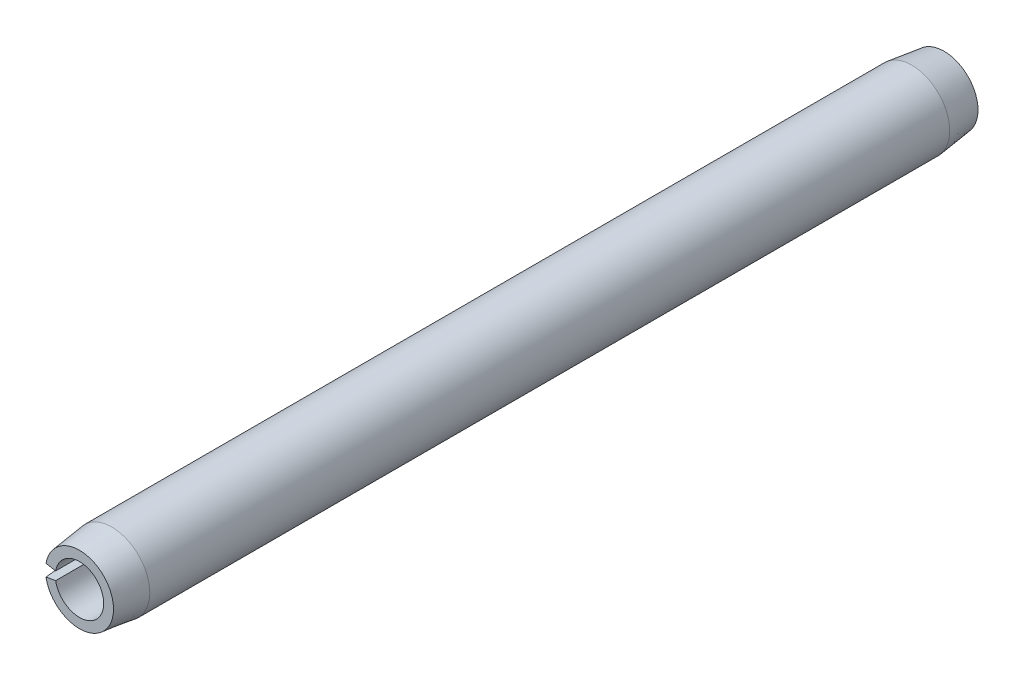
ISO-10303-21;
HEADER;
FILE_DESCRIPTION(('STEP AP214'),'2;1');
FILE_NAME('part.step','',(''),(''),'','','');
FILE_SCHEMA(('AUTOMOTIVE_DESIGN { 1 0 10303 214 1 1 1 1 }'));
ENDSEC;
DATA;
#1=APPLICATION_CONTEXT('core data for automotive mechanical design processes');
#2=APPLICATION_PROTOCOL_DEFINITION('international standard','automotive_design',2000,#1);
#3=PRODUCT_CONTEXT('',#1,'mechanical');
#4=PRODUCT('Part','Part','',(#3));
#5=PRODUCT_RELATED_PRODUCT_CATEGORY('part','',(#4));
#6=PRODUCT_DEFINITION_FORMATION('','',#4);
#7=PRODUCT_DEFINITION_CONTEXT('part definition',#1,'design');
#8=PRODUCT_DEFINITION('design','',#6,#7);
#9=PRODUCT_DEFINITION_SHAPE('','',#8);
#10=(LENGTH_UNIT() NAMED_UNIT(*) SI_UNIT(.MILLI.,.METRE.));
#11=(NAMED_UNIT(*) PLANE_ANGLE_UNIT() SI_UNIT($,.RADIAN.));
#12=(NAMED_UNIT(*) SI_UNIT($,.STERADIAN.) SOLID_ANGLE_UNIT());
#13=UNCERTAINTY_MEASURE_WITH_UNIT(LENGTH_MEASURE(1.E-05),#10,'distance_accuracy_value','');
#14=(GEOMETRIC_REPRESENTATION_CONTEXT(3) GLOBAL_UNCERTAINTY_ASSIGNED_CONTEXT((#13)) GLOBAL_UNIT_ASSIGNED_CONTEXT((#10,
#11,#12)) REPRESENTATION_CONTEXT('',''));
#15=CARTESIAN_POINT('',(0.,0.,0.));
#16=DIRECTION('',(0.,0.,1.));
#17=DIRECTION('',(1.,0.,0.));
#18=AXIS2_PLACEMENT_3D('',#15,#16,#17);
#19=CARTESIAN_POINT('',(0.,0.,9.52499999999999));
#20=DIRECTION('',(0.,0.,-1.));
#21=DIRECTION('',(-1.,0.,0.));
#22=AXIS2_PLACEMENT_3D('',#19,#20,#21);
#23=CYLINDRICAL_SURFACE('',#22,0.5334);
#24=CARTESIAN_POINT('',(0.,0.,-9.52500000000001));
#25=DIRECTION('',(0.,0.,-1.));
#26=DIRECTION('',(1.,0.,0.));
#27=AXIS2_PLACEMENT_3D('',#24,#25,#26);
#28=CIRCLE('',#27,0.5334);
#29=CARTESIAN_POINT('',(-0.525296455456681,0.0926239379675509,-9.52500000000001));
#30=VERTEX_POINT('',#29);
#31=CARTESIAN_POINT('',(-0.525296455456709,-0.0926239379675231,-9.52500000000001));
#32=VERTEX_POINT('',#31);
#33=EDGE_CURVE('E120',#30,#32,#28,.T.);
#34=ORIENTED_EDGE('',*,*,#33,.T.);
#35=DIRECTION('',(0.,0.,-1.));
#36=VECTOR('',#35,1.);
#37=CARTESIAN_POINT('',(-0.525296455456709,-0.0926239379675231,9.52499999999999));
#38=LINE('',#37,#36);
#39=CARTESIAN_POINT('',(-0.525296455456709,-0.0926239379675231,9.52499999999999));
#40=VERTEX_POINT('',#39);
#41=EDGE_CURVE('E11',#40,#32,#38,.T.);
#42=ORIENTED_EDGE('',*,*,#41,.F.);
#43=CARTESIAN_POINT('',(0.,0.,9.52499999999999));
#44=DIRECTION('',(0.,0.,-1.));
#45=DIRECTION('',(1.,0.,0.));
#46=AXIS2_PLACEMENT_3D('',#43,#44,#45);
#47=CIRCLE('',#46,0.5334);
#48=CARTESIAN_POINT('',(-0.525296455456681,0.0926239379675509,9.52499999999999));
#49=VERTEX_POINT('',#48);
#50=EDGE_CURVE('E116',#49,#40,#47,.T.);
#51=ORIENTED_EDGE('',*,*,#50,.F.);
#52=DIRECTION('',(0.,0.,-1.));
#53=VECTOR('',#52,1.);
#54=CARTESIAN_POINT('',(-0.525296455456681,0.0926239379675509,9.52499999999999));
#55=LINE('',#54,#53);
#56=EDGE_CURVE('E109',#49,#30,#55,.T.);
#57=ORIENTED_EDGE('',*,*,#56,.T.);
#58=EDGE_LOOP('',(#34,#42,#51,#57));
#59=FACE_BOUND('',#58,.T.);
#60=ADVANCED_FACE('F37',(#59),#23,.F.);
#61=CARTESIAN_POINT('',(-0.525296455456709,-0.0926239379675231,9.52499999999999));
#62=DIRECTION('',(0.173648177666927,-0.984807753012209,0.));
#63=DIRECTION('',(0.984807753012209,0.173648177666927,0.));
#64=AXIS2_PLACEMENT_3D('',#61,#62,#63);
#65=PLANE('',#64);
#66=DIRECTION('',(0.,0.,-1.));
#67=VECTOR('',#66,1.);
#68=CARTESIAN_POINT('',(-0.825465858574778,-0.145551902520413,9.52499999999999));
#69=LINE('',#68,#67);
#70=CARTESIAN_POINT('',(-0.825465858574778,-0.145551902520413,8.8138));
#71=VERTEX_POINT('',#70);
#72=CARTESIAN_POINT('',(-0.825465858574778,-0.145551902520413,-8.8138));
#73=VERTEX_POINT('',#72);
#74=EDGE_CURVE('E44',#71,#73,#69,.T.);
#75=ORIENTED_EDGE('',*,*,#74,.F.);
#76=DIRECTION('',(-0.122150368266264,-0.0215384056288171,-0.992277876713668));
#77=VECTOR('',#76,1.);
#78=CARTESIAN_POINT('',(0.,0.,15.5194));
#79=LINE('',#78,#77);
#80=CARTESIAN_POINT('',(-0.737916449332049,-0.130114579525831,9.52499999999999));
#81=VERTEX_POINT('',#80);
#82=EDGE_CURVE('E91',#71,#81,#79,.F.);
#83=ORIENTED_EDGE('',*,*,#82,.T.);
#84=DIRECTION('',(-0.984807753012209,-0.173648177666927,0.));
#85=VECTOR('',#84,1.);
#86=CARTESIAN_POINT('',(-0.525296455456709,-0.0926239379675231,9.52499999999999));
#87=LINE('',#86,#85);
#88=EDGE_CURVE('E124',#40,#81,#87,.T.);
#89=ORIENTED_EDGE('',*,*,#88,.F.);
#90=ORIENTED_EDGE('',*,*,#41,.T.);
#91=DIRECTION('',(-0.984807753012209,-0.173648177666927,0.));
#92=VECTOR('',#91,1.);
#93=CARTESIAN_POINT('',(-0.525296455456709,-0.0926239379675231,-9.52500000000001));
#94=LINE('',#93,#92);
#95=CARTESIAN_POINT('',(-0.737916449332049,-0.130114579525831,-9.52500000000001));
#96=VERTEX_POINT('',#95);
#97=EDGE_CURVE('E117',#32,#96,#94,.T.);
#98=ORIENTED_EDGE('',*,*,#97,.T.);
#99=DIRECTION('',(0.122150368266264,0.021538405628817,-0.992277876713668));
#100=VECTOR('',#99,1.);
#101=CARTESIAN_POINT('',(0.,0.,-15.5194));
#102=LINE('',#101,#100);
#103=EDGE_CURVE('E59',#96,#73,#102,.F.);
#104=ORIENTED_EDGE('',*,*,#103,.T.);
#105=EDGE_LOOP('',(#75,#83,#89,#90,#98,#104));
#106=FACE_BOUND('',#105,.T.);
#107=ADVANCED_FACE('F138',(#106),#65,.F.);
#108=CARTESIAN_POINT('',(0.,0.,9.52499999999999));
#109=DIRECTION('',(0.,0.,-1.));
#110=DIRECTION('',(-1.,0.,0.));
#111=AXIS2_PLACEMENT_3D('',#108,#109,#110);
#112=CYLINDRICAL_SURFACE('',#111,0.8382);
#113=DIRECTION('',(0.,0.,-1.));
#114=VECTOR('',#113,1.);
#115=CARTESIAN_POINT('',(-0.825465858574848,0.145551902520413,9.52499999999999));
#116=LINE('',#115,#114);
#117=CARTESIAN_POINT('',(-0.825465858574848,0.145551902520413,8.8138));
#118=VERTEX_POINT('',#117);
#119=CARTESIAN_POINT('',(-0.825465858574848,0.145551902520413,-8.8138));
#120=VERTEX_POINT('',#119);
#121=EDGE_CURVE('E101',#118,#120,#116,.T.);
#122=ORIENTED_EDGE('',*,*,#121,.F.);
#123=CARTESIAN_POINT('',(0.,0.,8.8138));
#124=DIRECTION('',(0.,0.,-1.));
#125=DIRECTION('',(-1.,0.,0.));
#126=AXIS2_PLACEMENT_3D('',#123,#124,#125);
#127=CIRCLE('',#126,0.838200000000001);
#128=EDGE_CURVE('E88',#118,#71,#127,.T.);
#129=ORIENTED_EDGE('',*,*,#128,.T.);
#130=ORIENTED_EDGE('',*,*,#74,.T.);
#131=CARTESIAN_POINT('',(0.,0.,-8.8138));
#132=DIRECTION('',(0.,0.,-1.));
#133=DIRECTION('',(-1.,0.,0.));
#134=AXIS2_PLACEMENT_3D('',#131,#132,#133);
#135=CIRCLE('',#134,0.838200000000001);
#136=EDGE_CURVE('E108',#120,#73,#135,.T.);
#137=ORIENTED_EDGE('',*,*,#136,.F.);
#138=EDGE_LOOP('',(#122,#129,#130,#137));
#139=FACE_BOUND('',#138,.T.);
#140=ADVANCED_FACE('F107',(#139),#112,.T.);
#141=CARTESIAN_POINT('',(-0.825465858574848,0.145551902520413,9.52499999999999));
#142=DIRECTION('',(0.173648177666927,0.984807753012209,0.));
#143=DIRECTION('',(-0.984807753012208,0.173648177666927,0.));
#144=AXIS2_PLACEMENT_3D('',#141,#142,#143);
#145=PLANE('',#144);
#146=DIRECTION('',(0.984807753012208,-0.173648177666927,0.));
#147=VECTOR('',#146,1.);
#148=CARTESIAN_POINT('',(-0.825465858574848,0.145551902520413,9.52499999999999));
#149=LINE('',#148,#147);
#150=CARTESIAN_POINT('',(-0.737916449332049,0.130114579525831,9.52499999999999));
#151=VERTEX_POINT('',#150);
#152=EDGE_CURVE('E104',#151,#49,#149,.T.);
#153=ORIENTED_EDGE('',*,*,#152,.F.);
#154=DIRECTION('',(0.122150368266264,-0.021538405628817,0.992277876713668));
#155=VECTOR('',#154,1.);
#156=CARTESIAN_POINT('',(0.,0.,15.5194));
#157=LINE('',#156,#155);
#158=EDGE_CURVE('E51',#151,#118,#157,.F.);
#159=ORIENTED_EDGE('',*,*,#158,.T.);
#160=ORIENTED_EDGE('',*,*,#121,.T.);
#161=DIRECTION('',(-0.122150368266264,0.021538405628817,0.992277876713668));
#162=VECTOR('',#161,1.);
#163=CARTESIAN_POINT('',(0.,0.,-15.5194));
#164=LINE('',#163,#162);
#165=CARTESIAN_POINT('',(-0.737916449332049,0.130114579525831,-9.52500000000001));
#166=VERTEX_POINT('',#165);
#167=EDGE_CURVE('E130',#120,#166,#164,.F.);
#168=ORIENTED_EDGE('',*,*,#167,.T.);
#169=DIRECTION('',(0.984807753012208,-0.173648177666927,0.));
#170=VECTOR('',#169,1.);
#171=CARTESIAN_POINT('',(-0.825465858574848,0.145551902520413,-9.52500000000001));
#172=LINE('',#171,#170);
#173=EDGE_CURVE('E114',#166,#30,#172,.T.);
#174=ORIENTED_EDGE('',*,*,#173,.T.);
#175=ORIENTED_EDGE('',*,*,#56,.F.);
#176=EDGE_LOOP('',(#153,#159,#160,#168,#174,#175));
#177=FACE_BOUND('',#176,.T.);
#178=ADVANCED_FACE('F99',(#177),#145,.F.);
#179=CARTESIAN_POINT('',(0.,0.,9.52499999999999));
#180=DIRECTION('',(0.,0.,1.));
#181=DIRECTION('',(1.,0.,0.));
#182=AXIS2_PLACEMENT_3D('',#179,#180,#181);
#183=PLANE('',#182);
#184=CARTESIAN_POINT('',(0.,0.,9.52499999999999));
#185=DIRECTION('',(0.,0.,-1.));
#186=DIRECTION('',(-1.,0.,0.));
#187=AXIS2_PLACEMENT_3D('',#184,#185,#186);
#188=CIRCLE('',#187,0.749300000000001);
#189=EDGE_CURVE('E95',#151,#81,#188,.T.);
#190=ORIENTED_EDGE('',*,*,#189,.F.);
#191=ORIENTED_EDGE('',*,*,#152,.T.);
#192=ORIENTED_EDGE('',*,*,#50,.T.);
#193=ORIENTED_EDGE('',*,*,#88,.T.);
#194=EDGE_LOOP('',(#190,#191,#192,#193));
#195=FACE_BOUND('',#194,.T.);
#196=ADVANCED_FACE('F139',(#195),#183,.T.);
#197=CARTESIAN_POINT('',(0.,0.,-9.52500000000001));
#198=DIRECTION('',(0.,0.,1.));
#199=DIRECTION('',(1.,0.,0.));
#200=AXIS2_PLACEMENT_3D('',#197,#198,#199);
#201=PLANE('',#200);
#202=ORIENTED_EDGE('',*,*,#173,.F.);
#203=CARTESIAN_POINT('',(0.,0.,-9.52500000000001));
#204=DIRECTION('',(0.,0.,-1.));
#205=DIRECTION('',(-1.,0.,0.));
#206=AXIS2_PLACEMENT_3D('',#203,#204,#205);
#207=CIRCLE('',#206,0.749300000000001);
#208=EDGE_CURVE('E132',#166,#96,#207,.T.);
#209=ORIENTED_EDGE('',*,*,#208,.T.);
#210=ORIENTED_EDGE('',*,*,#97,.F.);
#211=ORIENTED_EDGE('',*,*,#33,.F.);
#212=EDGE_LOOP('',(#202,#209,#210,#211));
#213=FACE_BOUND('',#212,.T.);
#214=ADVANCED_FACE('F146',(#213),#201,.F.);
#215=CARTESIAN_POINT('',(0.,0.,-8.8138));
#216=DIRECTION('',(0.,0.,1.));
#217=DIRECTION('',(1.,0.,0.));
#218=AXIS2_PLACEMENT_3D('',#215,#216,#217);
#219=CONICAL_SURFACE('',#218,0.838200000000001,0.124354994546761);
#220=ORIENTED_EDGE('',*,*,#208,.F.);
#221=ORIENTED_EDGE('',*,*,#167,.F.);
#222=ORIENTED_EDGE('',*,*,#136,.T.);
#223=ORIENTED_EDGE('',*,*,#103,.F.);
#224=EDGE_LOOP('',(#220,#221,#222,#223));
#225=FACE_BOUND('',#224,.T.);
#226=ADVANCED_FACE('F147',(#225),#219,.T.);
#227=CARTESIAN_POINT('',(0.,0.,9.52499999999999));
#228=DIRECTION('',(0.,0.,-1.));
#229=DIRECTION('',(-1.,0.,0.));
#230=AXIS2_PLACEMENT_3D('',#227,#228,#229);
#231=CONICAL_SURFACE('',#230,0.749300000000001,0.124354994546762);
#232=ORIENTED_EDGE('',*,*,#128,.F.);
#233=ORIENTED_EDGE('',*,*,#158,.F.);
#234=ORIENTED_EDGE('',*,*,#189,.T.);
#235=ORIENTED_EDGE('',*,*,#82,.F.);
#236=EDGE_LOOP('',(#232,#233,#234,#235));
#237=FACE_BOUND('',#236,.T.);
#238=ADVANCED_FACE('F89',(#237),#231,.T.);
#239=CLOSED_SHELL('',(#60,#107,#140,#178,#196,#214,#226,#238));
#240=MANIFOLD_SOLID_BREP('B2',#239);
#241=ADVANCED_BREP_SHAPE_REPRESENTATION('',(#18,#240),#14);
#242=SHAPE_DEFINITION_REPRESENTATION(#9,#241);
ENDSEC;
END-ISO-10303-21;
